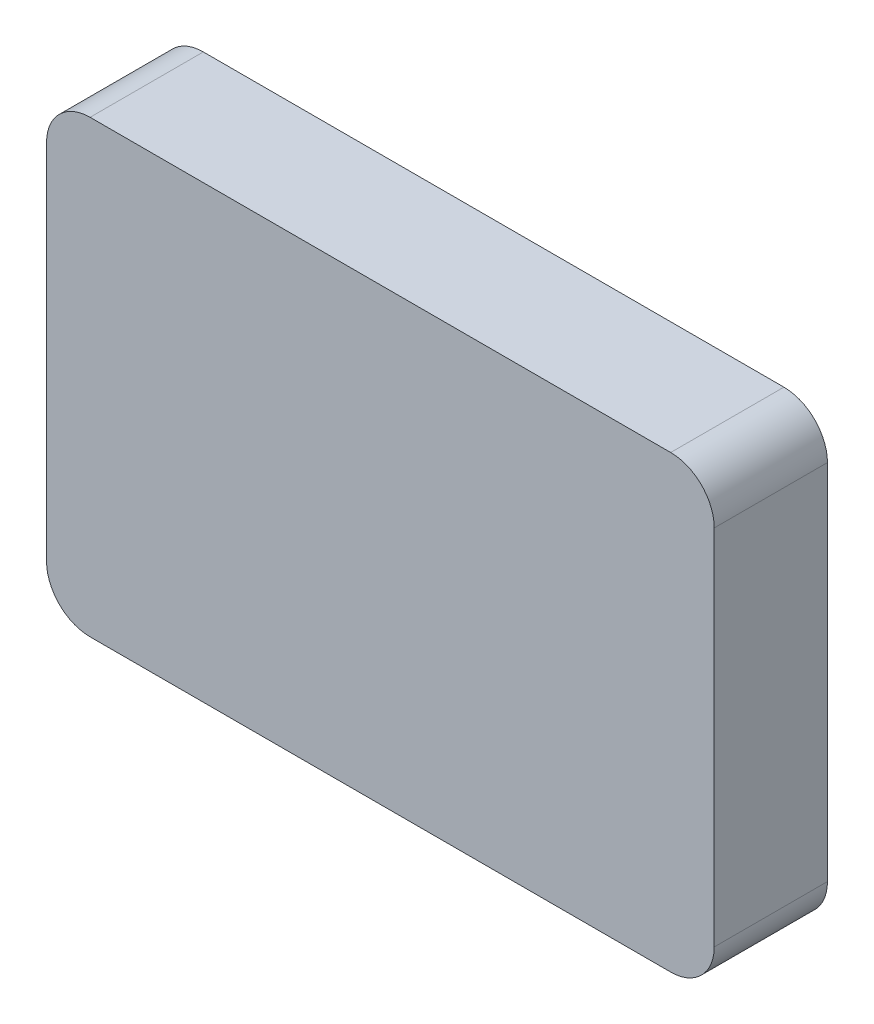
ISO-10303-21;
HEADER;
FILE_DESCRIPTION(('STEP AP214'),'2;1');
FILE_NAME('part.step','',(''),(''),'','','');
FILE_SCHEMA(('AUTOMOTIVE_DESIGN { 1 0 10303 214 1 1 1 1 }'));
ENDSEC;
DATA;
#1=APPLICATION_CONTEXT('core data for automotive mechanical design processes');
#2=APPLICATION_PROTOCOL_DEFINITION('international standard','automotive_design',2000,#1);
#3=PRODUCT_CONTEXT('',#1,'mechanical');
#4=PRODUCT('Part','Part','',(#3));
#5=PRODUCT_RELATED_PRODUCT_CATEGORY('part','',(#4));
#6=PRODUCT_DEFINITION_FORMATION('','',#4);
#7=PRODUCT_DEFINITION_CONTEXT('part definition',#1,'design');
#8=PRODUCT_DEFINITION('design','',#6,#7);
#9=PRODUCT_DEFINITION_SHAPE('','',#8);
#10=(LENGTH_UNIT() NAMED_UNIT(*) SI_UNIT(.MILLI.,.METRE.));
#11=(NAMED_UNIT(*) PLANE_ANGLE_UNIT() SI_UNIT($,.RADIAN.));
#12=(NAMED_UNIT(*) SI_UNIT($,.STERADIAN.) SOLID_ANGLE_UNIT());
#13=UNCERTAINTY_MEASURE_WITH_UNIT(LENGTH_MEASURE(1.E-05),#10,'distance_accuracy_value','');
#14=(GEOMETRIC_REPRESENTATION_CONTEXT(3) GLOBAL_UNCERTAINTY_ASSIGNED_CONTEXT((#13)) GLOBAL_UNIT_ASSIGNED_CONTEXT((#10,
#11,#12)) REPRESENTATION_CONTEXT('',''));
#15=CARTESIAN_POINT('',(0.,0.,0.));
#16=DIRECTION('',(0.,0.,1.));
#17=DIRECTION('',(1.,0.,0.));
#18=AXIS2_PLACEMENT_3D('',#15,#16,#17);
#19=CARTESIAN_POINT('',(-2.3,-1.25,0.52));
#20=DIRECTION('',(0.,0.,1.));
#21=DIRECTION('',(1.,0.,0.));
#22=AXIS2_PLACEMENT_3D('',#19,#20,#21);
#23=PLANE('',#22);
#24=DIRECTION('',(1.,0.,0.));
#25=VECTOR('',#24,1.);
#26=CARTESIAN_POINT('',(-2.,1.55,0.52));
#27=LINE('',#26,#25);
#28=CARTESIAN_POINT('',(2.,1.55,0.52));
#29=VERTEX_POINT('',#28);
#30=CARTESIAN_POINT('',(-2.,1.55,0.52));
#31=VERTEX_POINT('',#30);
#32=EDGE_CURVE('E83',#29,#31,#27,.F.);
#33=ORIENTED_EDGE('',*,*,#32,.F.);
#34=CARTESIAN_POINT('',(2.,1.25,0.52));
#35=DIRECTION('',(0.,0.,-1.));
#36=DIRECTION('',(-1.,0.,0.));
#37=AXIS2_PLACEMENT_3D('',#34,#35,#36);
#38=CIRCLE('',#37,0.3);
#39=CARTESIAN_POINT('',(2.3,1.25,0.52));
#40=VERTEX_POINT('',#39);
#41=EDGE_CURVE('E98',#40,#29,#38,.F.);
#42=ORIENTED_EDGE('',*,*,#41,.F.);
#43=DIRECTION('',(0.,1.,0.));
#44=VECTOR('',#43,1.);
#45=CARTESIAN_POINT('',(2.3,1.25,0.52));
#46=LINE('',#45,#44);
#47=CARTESIAN_POINT('',(2.3,-1.25,0.52));
#48=VERTEX_POINT('',#47);
#49=EDGE_CURVE('E103',#48,#40,#46,.T.);
#50=ORIENTED_EDGE('',*,*,#49,.F.);
#51=CARTESIAN_POINT('',(2.,-1.25,0.52));
#52=DIRECTION('',(0.,0.,-1.));
#53=DIRECTION('',(-1.,0.,0.));
#54=AXIS2_PLACEMENT_3D('',#51,#52,#53);
#55=CIRCLE('',#54,0.3);
#56=CARTESIAN_POINT('',(2.,-1.55,0.52));
#57=VERTEX_POINT('',#56);
#58=EDGE_CURVE('E126',#57,#48,#55,.F.);
#59=ORIENTED_EDGE('',*,*,#58,.F.);
#60=DIRECTION('',(1.,0.,0.));
#61=VECTOR('',#60,1.);
#62=CARTESIAN_POINT('',(2.,-1.55,0.52));
#63=LINE('',#62,#61);
#64=CARTESIAN_POINT('',(-2.,-1.55,0.52));
#65=VERTEX_POINT('',#64);
#66=EDGE_CURVE('E107',#65,#57,#63,.T.);
#67=ORIENTED_EDGE('',*,*,#66,.F.);
#68=CARTESIAN_POINT('',(-2.,-1.25,0.52));
#69=DIRECTION('',(0.,0.,-1.));
#70=DIRECTION('',(-1.,0.,0.));
#71=AXIS2_PLACEMENT_3D('',#68,#69,#70);
#72=CIRCLE('',#71,0.3);
#73=CARTESIAN_POINT('',(-2.3,-1.25,0.52));
#74=VERTEX_POINT('',#73);
#75=EDGE_CURVE('E127',#74,#65,#72,.F.);
#76=ORIENTED_EDGE('',*,*,#75,.F.);
#77=DIRECTION('',(0.,1.,0.));
#78=VECTOR('',#77,1.);
#79=CARTESIAN_POINT('',(-2.3,-1.25,0.52));
#80=LINE('',#79,#78);
#81=CARTESIAN_POINT('',(-2.3,1.25,0.52));
#82=VERTEX_POINT('',#81);
#83=EDGE_CURVE('E85',#82,#74,#80,.F.);
#84=ORIENTED_EDGE('',*,*,#83,.F.);
#85=CARTESIAN_POINT('',(-2.,1.25,0.52));
#86=DIRECTION('',(0.,0.,-1.));
#87=DIRECTION('',(-1.,0.,0.));
#88=AXIS2_PLACEMENT_3D('',#85,#86,#87);
#89=CIRCLE('',#88,0.3);
#90=EDGE_CURVE('E20',#31,#82,#89,.F.);
#91=ORIENTED_EDGE('',*,*,#90,.F.);
#92=EDGE_LOOP('',(#33,#42,#50,#59,#67,#76,#84,#91));
#93=FACE_BOUND('',#92,.T.);
#94=ADVANCED_FACE('F17',(#93),#23,.F.);
#95=CARTESIAN_POINT('',(-2.,1.25,0.52));
#96=DIRECTION('',(0.,0.,-1.));
#97=DIRECTION('',(-1.,0.,0.));
#98=AXIS2_PLACEMENT_3D('',#95,#96,#97);
#99=CYLINDRICAL_SURFACE('',#98,0.3);
#100=ORIENTED_EDGE('',*,*,#90,.T.);
#101=DIRECTION('',(0.,0.,1.));
#102=VECTOR('',#101,1.);
#103=CARTESIAN_POINT('',(-2.3,1.25,0.52));
#104=LINE('',#103,#102);
#105=CARTESIAN_POINT('',(-2.3,1.25,1.29999997139));
#106=VERTEX_POINT('',#105);
#107=EDGE_CURVE('E88',#106,#82,#104,.F.);
#108=ORIENTED_EDGE('',*,*,#107,.F.);
#109=CARTESIAN_POINT('',(-2.,1.25,1.29999997139));
#110=DIRECTION('',(0.,0.,-1.));
#111=DIRECTION('',(-1.,0.,0.));
#112=AXIS2_PLACEMENT_3D('',#109,#110,#111);
#113=CIRCLE('',#112,0.3);
#114=CARTESIAN_POINT('',(-2.,1.55,1.29999997139));
#115=VERTEX_POINT('',#114);
#116=EDGE_CURVE('E93',#115,#106,#113,.F.);
#117=ORIENTED_EDGE('',*,*,#116,.F.);
#118=DIRECTION('',(0.,0.,1.));
#119=VECTOR('',#118,1.);
#120=CARTESIAN_POINT('',(-2.,1.55,0.52));
#121=LINE('',#120,#119);
#122=EDGE_CURVE('E90',#31,#115,#121,.T.);
#123=ORIENTED_EDGE('',*,*,#122,.F.);
#124=EDGE_LOOP('',(#100,#108,#117,#123));
#125=FACE_BOUND('',#124,.T.);
#126=ADVANCED_FACE('F91',(#125),#99,.T.);
#127=CARTESIAN_POINT('',(-2.3,-1.25,0.52));
#128=DIRECTION('',(-1.,0.,0.));
#129=DIRECTION('',(0.,0.,1.));
#130=AXIS2_PLACEMENT_3D('',#127,#128,#129);
#131=PLANE('',#130);
#132=DIRECTION('',(0.,0.,-1.));
#133=VECTOR('',#132,1.);
#134=CARTESIAN_POINT('',(-2.3,-1.25,0.52));
#135=LINE('',#134,#133);
#136=CARTESIAN_POINT('',(-2.3,-1.25,1.29999997139));
#137=VERTEX_POINT('',#136);
#138=EDGE_CURVE('E112',#137,#74,#135,.T.);
#139=ORIENTED_EDGE('',*,*,#138,.F.);
#140=DIRECTION('',(0.,1.,0.));
#141=VECTOR('',#140,1.);
#142=CARTESIAN_POINT('',(-2.3,-1.25,1.29999997139));
#143=LINE('',#142,#141);
#144=EDGE_CURVE('E123',#106,#137,#143,.F.);
#145=ORIENTED_EDGE('',*,*,#144,.F.);
#146=ORIENTED_EDGE('',*,*,#107,.T.);
#147=ORIENTED_EDGE('',*,*,#83,.T.);
#148=EDGE_LOOP('',(#139,#145,#146,#147));
#149=FACE_BOUND('',#148,.T.);
#150=ADVANCED_FACE('F216',(#149),#131,.T.);
#151=CARTESIAN_POINT('',(-2.,-1.25,0.52));
#152=DIRECTION('',(0.,0.,-1.));
#153=DIRECTION('',(-1.,0.,0.));
#154=AXIS2_PLACEMENT_3D('',#151,#152,#153);
#155=CYLINDRICAL_SURFACE('',#154,0.3);
#156=ORIENTED_EDGE('',*,*,#75,.T.);
#157=DIRECTION('',(0.,0.,-1.));
#158=VECTOR('',#157,1.);
#159=CARTESIAN_POINT('',(-2.,-1.55,0.52));
#160=LINE('',#159,#158);
#161=CARTESIAN_POINT('',(-2.,-1.55,1.29999997139));
#162=VERTEX_POINT('',#161);
#163=EDGE_CURVE('E110',#162,#65,#160,.T.);
#164=ORIENTED_EDGE('',*,*,#163,.F.);
#165=CARTESIAN_POINT('',(-2.,-1.25,1.29999997139));
#166=DIRECTION('',(0.,0.,-1.));
#167=DIRECTION('',(-1.,0.,0.));
#168=AXIS2_PLACEMENT_3D('',#165,#166,#167);
#169=CIRCLE('',#168,0.3);
#170=EDGE_CURVE('E120',#137,#162,#169,.F.);
#171=ORIENTED_EDGE('',*,*,#170,.F.);
#172=ORIENTED_EDGE('',*,*,#138,.T.);
#173=EDGE_LOOP('',(#156,#164,#171,#172));
#174=FACE_BOUND('',#173,.T.);
#175=ADVANCED_FACE('F206',(#174),#155,.T.);
#176=CARTESIAN_POINT('',(2.,-1.55,0.52));
#177=DIRECTION('',(0.,-1.,0.));
#178=DIRECTION('',(0.,0.,-1.));
#179=AXIS2_PLACEMENT_3D('',#176,#177,#178);
#180=PLANE('',#179);
#181=DIRECTION('',(0.,0.,-1.));
#182=VECTOR('',#181,1.);
#183=CARTESIAN_POINT('',(2.,-1.55,0.52));
#184=LINE('',#183,#182);
#185=CARTESIAN_POINT('',(2.,-1.55,1.29999997139));
#186=VERTEX_POINT('',#185);
#187=EDGE_CURVE('E109',#186,#57,#184,.T.);
#188=ORIENTED_EDGE('',*,*,#187,.F.);
#189=DIRECTION('',(1.,0.,0.));
#190=VECTOR('',#189,1.);
#191=CARTESIAN_POINT('',(-2.3,-1.55,1.29999997139));
#192=LINE('',#191,#190);
#193=EDGE_CURVE('E119',#162,#186,#192,.T.);
#194=ORIENTED_EDGE('',*,*,#193,.F.);
#195=ORIENTED_EDGE('',*,*,#163,.T.);
#196=ORIENTED_EDGE('',*,*,#66,.T.);
#197=EDGE_LOOP('',(#188,#194,#195,#196));
#198=FACE_BOUND('',#197,.T.);
#199=ADVANCED_FACE('F196',(#198),#180,.T.);
#200=CARTESIAN_POINT('',(2.,-1.25,0.52));
#201=DIRECTION('',(0.,0.,-1.));
#202=DIRECTION('',(-1.,0.,0.));
#203=AXIS2_PLACEMENT_3D('',#200,#201,#202);
#204=CYLINDRICAL_SURFACE('',#203,0.3);
#205=ORIENTED_EDGE('',*,*,#58,.T.);
#206=DIRECTION('',(0.,0.,-1.));
#207=VECTOR('',#206,1.);
#208=CARTESIAN_POINT('',(2.3,-1.25,0.52));
#209=LINE('',#208,#207);
#210=CARTESIAN_POINT('',(2.3,-1.25,1.29999997139));
#211=VERTEX_POINT('',#210);
#212=EDGE_CURVE('E106',#211,#48,#209,.T.);
#213=ORIENTED_EDGE('',*,*,#212,.F.);
#214=CARTESIAN_POINT('',(2.,-1.25,1.29999997139));
#215=DIRECTION('',(0.,0.,-1.));
#216=DIRECTION('',(-1.,0.,0.));
#217=AXIS2_PLACEMENT_3D('',#214,#215,#216);
#218=CIRCLE('',#217,0.3);
#219=EDGE_CURVE('E116',#186,#211,#218,.F.);
#220=ORIENTED_EDGE('',*,*,#219,.F.);
#221=ORIENTED_EDGE('',*,*,#187,.T.);
#222=EDGE_LOOP('',(#205,#213,#220,#221));
#223=FACE_BOUND('',#222,.T.);
#224=ADVANCED_FACE('F162',(#223),#204,.T.);
#225=CARTESIAN_POINT('',(2.3,1.25,0.52));
#226=DIRECTION('',(1.,0.,0.));
#227=DIRECTION('',(0.,0.,-1.));
#228=AXIS2_PLACEMENT_3D('',#225,#226,#227);
#229=PLANE('',#228);
#230=DIRECTION('',(0.,0.,-1.));
#231=VECTOR('',#230,1.);
#232=CARTESIAN_POINT('',(2.3,1.25,0.52));
#233=LINE('',#232,#231);
#234=CARTESIAN_POINT('',(2.3,1.25,1.29999997139));
#235=VERTEX_POINT('',#234);
#236=EDGE_CURVE('E105',#235,#40,#233,.T.);
#237=ORIENTED_EDGE('',*,*,#236,.F.);
#238=DIRECTION('',(0.,1.,0.));
#239=VECTOR('',#238,1.);
#240=CARTESIAN_POINT('',(2.3,-1.25,1.29999997139));
#241=LINE('',#240,#239);
#242=EDGE_CURVE('E115',#211,#235,#241,.T.);
#243=ORIENTED_EDGE('',*,*,#242,.F.);
#244=ORIENTED_EDGE('',*,*,#212,.T.);
#245=ORIENTED_EDGE('',*,*,#49,.T.);
#246=EDGE_LOOP('',(#237,#243,#244,#245));
#247=FACE_BOUND('',#246,.T.);
#248=ADVANCED_FACE('F151',(#247),#229,.T.);
#249=CARTESIAN_POINT('',(2.,1.25,0.52));
#250=DIRECTION('',(0.,0.,-1.));
#251=DIRECTION('',(-1.,0.,0.));
#252=AXIS2_PLACEMENT_3D('',#249,#250,#251);
#253=CYLINDRICAL_SURFACE('',#252,0.3);
#254=ORIENTED_EDGE('',*,*,#41,.T.);
#255=DIRECTION('',(0.,0.,1.));
#256=VECTOR('',#255,1.);
#257=CARTESIAN_POINT('',(2.,1.55,0.52));
#258=LINE('',#257,#256);
#259=CARTESIAN_POINT('',(2.,1.55,1.29999997139));
#260=VERTEX_POINT('',#259);
#261=EDGE_CURVE('E35',#260,#29,#258,.F.);
#262=ORIENTED_EDGE('',*,*,#261,.F.);
#263=CARTESIAN_POINT('',(2.,1.25,1.29999997139));
#264=DIRECTION('',(0.,0.,-1.));
#265=DIRECTION('',(-1.,0.,0.));
#266=AXIS2_PLACEMENT_3D('',#263,#264,#265);
#267=CIRCLE('',#266,0.3);
#268=EDGE_CURVE('E26',#235,#260,#267,.F.);
#269=ORIENTED_EDGE('',*,*,#268,.F.);
#270=ORIENTED_EDGE('',*,*,#236,.T.);
#271=EDGE_LOOP('',(#254,#262,#269,#270));
#272=FACE_BOUND('',#271,.T.);
#273=ADVANCED_FACE('F153',(#272),#253,.T.);
#274=CARTESIAN_POINT('',(-2.,1.55,0.52));
#275=DIRECTION('',(0.,1.,0.));
#276=DIRECTION('',(0.,0.,1.));
#277=AXIS2_PLACEMENT_3D('',#274,#275,#276);
#278=PLANE('',#277);
#279=ORIENTED_EDGE('',*,*,#122,.T.);
#280=DIRECTION('',(1.,0.,0.));
#281=VECTOR('',#280,1.);
#282=CARTESIAN_POINT('',(-2.3,1.55,1.29999997139));
#283=LINE('',#282,#281);
#284=EDGE_CURVE('E11',#260,#115,#283,.F.);
#285=ORIENTED_EDGE('',*,*,#284,.F.);
#286=ORIENTED_EDGE('',*,*,#261,.T.);
#287=ORIENTED_EDGE('',*,*,#32,.T.);
#288=EDGE_LOOP('',(#279,#285,#286,#287));
#289=FACE_BOUND('',#288,.T.);
#290=ADVANCED_FACE('F96',(#289),#278,.T.);
#291=CARTESIAN_POINT('',(-2.3,-1.25,1.29999997139));
#292=DIRECTION('',(0.,0.,1.));
#293=DIRECTION('',(1.,0.,0.));
#294=AXIS2_PLACEMENT_3D('',#291,#292,#293);
#295=PLANE('',#294);
#296=ORIENTED_EDGE('',*,*,#268,.T.);
#297=ORIENTED_EDGE('',*,*,#284,.T.);
#298=ORIENTED_EDGE('',*,*,#116,.T.);
#299=ORIENTED_EDGE('',*,*,#144,.T.);
#300=ORIENTED_EDGE('',*,*,#170,.T.);
#301=ORIENTED_EDGE('',*,*,#193,.T.);
#302=ORIENTED_EDGE('',*,*,#219,.T.);
#303=ORIENTED_EDGE('',*,*,#242,.T.);
#304=EDGE_LOOP('',(#296,#297,#298,#299,#300,#301,#302,#303));
#305=FACE_BOUND('',#304,.T.);
#306=ADVANCED_FACE('F148',(#305),#295,.T.);
#307=CLOSED_SHELL('',(#94,#126,#150,#175,#199,#224,#248,#273,#290,#306));
#308=MANIFOLD_SOLID_BREP('B1',#307);
#309=ADVANCED_BREP_SHAPE_REPRESENTATION('',(#18,#308),#14);
#310=SHAPE_DEFINITION_REPRESENTATION(#9,#309);
ENDSEC;
END-ISO-10303-21;
